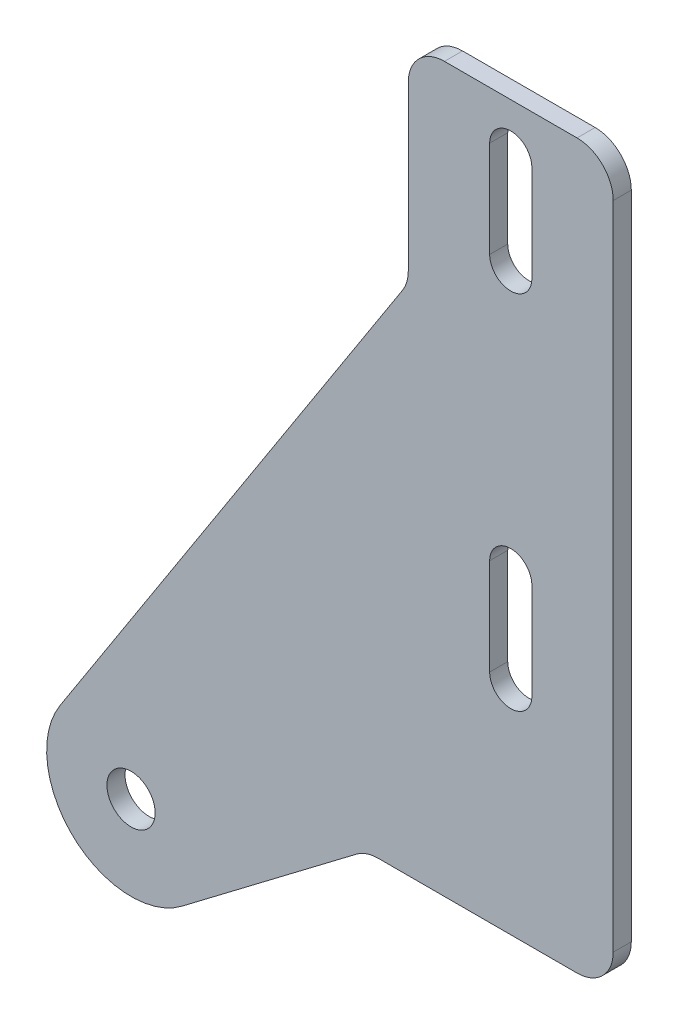
ISO-10303-21;
HEADER;
FILE_DESCRIPTION(('STEP AP214'),'2;1');
FILE_NAME('part.step','',(''),(''),'','','');
FILE_SCHEMA(('AUTOMOTIVE_DESIGN { 1 0 10303 214 1 1 1 1 }'));
ENDSEC;
DATA;
#1=APPLICATION_CONTEXT('core data for automotive mechanical design processes');
#2=APPLICATION_PROTOCOL_DEFINITION('international standard','automotive_design',2000,#1);
#3=PRODUCT_CONTEXT('',#1,'mechanical');
#4=PRODUCT('Part','Part','',(#3));
#5=PRODUCT_RELATED_PRODUCT_CATEGORY('part','',(#4));
#6=PRODUCT_DEFINITION_FORMATION('','',#4);
#7=PRODUCT_DEFINITION_CONTEXT('part definition',#1,'design');
#8=PRODUCT_DEFINITION('design','',#6,#7);
#9=PRODUCT_DEFINITION_SHAPE('','',#8);
#10=(LENGTH_UNIT() NAMED_UNIT(*) SI_UNIT(.MILLI.,.METRE.));
#11=(NAMED_UNIT(*) PLANE_ANGLE_UNIT() SI_UNIT($,.RADIAN.));
#12=(NAMED_UNIT(*) SI_UNIT($,.STERADIAN.) SOLID_ANGLE_UNIT());
#13=UNCERTAINTY_MEASURE_WITH_UNIT(LENGTH_MEASURE(1.E-05),#10,'distance_accuracy_value','');
#14=(GEOMETRIC_REPRESENTATION_CONTEXT(3) GLOBAL_UNCERTAINTY_ASSIGNED_CONTEXT((#13)) GLOBAL_UNIT_ASSIGNED_CONTEXT((#10,
#11,#12)) REPRESENTATION_CONTEXT('',''));
#15=CARTESIAN_POINT('',(0.,0.,0.));
#16=DIRECTION('',(0.,0.,1.));
#17=DIRECTION('',(1.,0.,0.));
#18=AXIS2_PLACEMENT_3D('',#15,#16,#17);
#19=CARTESIAN_POINT('',(-8.5,38.,-1.5));
#20=DIRECTION('',(-1.,0.,0.));
#21=DIRECTION('',(0.,-1.,0.));
#22=AXIS2_PLACEMENT_3D('',#19,#20,#21);
#23=PLANE('',#22);
#24=DIRECTION('',(0.,-1.,0.));
#25=VECTOR('',#24,1.);
#26=CARTESIAN_POINT('',(-8.5,38.,-1.5));
#27=LINE('',#26,#25);
#28=CARTESIAN_POINT('',(-8.5,35.,-1.5));
#29=VERTEX_POINT('',#28);
#30=CARTESIAN_POINT('',(-8.5,21.4410366100826,-1.5));
#31=VERTEX_POINT('',#30);
#32=EDGE_CURVE('E256',#29,#31,#27,.T.);
#33=ORIENTED_EDGE('',*,*,#32,.T.);
#34=DIRECTION('',(0.,0.,1.));
#35=VECTOR('',#34,1.);
#36=CARTESIAN_POINT('',(-8.5,21.4410366100826,0.));
#37=LINE('',#36,#35);
#38=CARTESIAN_POINT('',(-8.5,21.4410366100826,0.));
#39=VERTEX_POINT('',#38);
#40=EDGE_CURVE('E301',#31,#39,#37,.T.);
#41=ORIENTED_EDGE('',*,*,#40,.T.);
#42=DIRECTION('',(0.,-1.,0.));
#43=VECTOR('',#42,1.);
#44=CARTESIAN_POINT('',(-8.5,38.,0.));
#45=LINE('',#44,#43);
#46=CARTESIAN_POINT('',(-8.5,35.,0.));
#47=VERTEX_POINT('',#46);
#48=EDGE_CURVE('E249',#47,#39,#45,.T.);
#49=ORIENTED_EDGE('',*,*,#48,.F.);
#50=DIRECTION('',(0.,0.,1.));
#51=VECTOR('',#50,1.);
#52=CARTESIAN_POINT('',(-8.5,35.,-1.5));
#53=LINE('',#52,#51);
#54=EDGE_CURVE('E297',#47,#29,#53,.F.);
#55=ORIENTED_EDGE('',*,*,#54,.T.);
#56=EDGE_LOOP('',(#33,#41,#49,#55));
#57=FACE_BOUND('',#56,.T.);
#58=ADVANCED_FACE('F38',(#57),#23,.T.);
#59=CARTESIAN_POINT('',(-8.5,38.,-1.5));
#60=DIRECTION('',(0.,1.,0.));
#61=DIRECTION('',(0.,0.,1.));
#62=AXIS2_PLACEMENT_3D('',#59,#60,#61);
#63=PLANE('',#62);
#64=DIRECTION('',(-1.,0.,0.));
#65=VECTOR('',#64,1.);
#66=CARTESIAN_POINT('',(-8.5,38.,-1.5));
#67=LINE('',#66,#65);
#68=CARTESIAN_POINT('',(5.5,38.,-1.5));
#69=VERTEX_POINT('',#68);
#70=CARTESIAN_POINT('',(-5.5,38.,-1.5));
#71=VERTEX_POINT('',#70);
#72=EDGE_CURVE('E274',#69,#71,#67,.T.);
#73=ORIENTED_EDGE('',*,*,#72,.T.);
#74=DIRECTION('',(0.,0.,1.));
#75=VECTOR('',#74,1.);
#76=CARTESIAN_POINT('',(-5.5,38.,-1.5));
#77=LINE('',#76,#75);
#78=CARTESIAN_POINT('',(-5.5,38.,0.));
#79=VERTEX_POINT('',#78);
#80=EDGE_CURVE('E331',#71,#79,#77,.T.);
#81=ORIENTED_EDGE('',*,*,#80,.T.);
#82=DIRECTION('',(-1.,0.,0.));
#83=VECTOR('',#82,1.);
#84=CARTESIAN_POINT('',(-8.5,38.,0.));
#85=LINE('',#84,#83);
#86=CARTESIAN_POINT('',(5.5,38.,0.));
#87=VERTEX_POINT('',#86);
#88=EDGE_CURVE('E260',#87,#79,#85,.T.);
#89=ORIENTED_EDGE('',*,*,#88,.F.);
#90=DIRECTION('',(0.,0.,1.));
#91=VECTOR('',#90,1.);
#92=CARTESIAN_POINT('',(5.5,38.,-1.5));
#93=LINE('',#92,#91);
#94=EDGE_CURVE('E60',#87,#69,#93,.F.);
#95=ORIENTED_EDGE('',*,*,#94,.T.);
#96=EDGE_LOOP('',(#73,#81,#89,#95));
#97=FACE_BOUND('',#96,.T.);
#98=ADVANCED_FACE('F373',(#97),#63,.T.);
#99=CARTESIAN_POINT('',(8.5,38.,-1.5));
#100=DIRECTION('',(1.,0.,0.));
#101=DIRECTION('',(0.,1.,0.));
#102=AXIS2_PLACEMENT_3D('',#99,#100,#101);
#103=PLANE('',#102);
#104=DIRECTION('',(0.,1.,0.));
#105=VECTOR('',#104,1.);
#106=CARTESIAN_POINT('',(8.5,38.,0.));
#107=LINE('',#106,#105);
#108=CARTESIAN_POINT('',(8.50000000000001,-19.,0.));
#109=VERTEX_POINT('',#108);
#110=CARTESIAN_POINT('',(8.5,35.,0.));
#111=VERTEX_POINT('',#110);
#112=EDGE_CURVE('E290',#109,#111,#107,.T.);
#113=ORIENTED_EDGE('',*,*,#112,.F.);
#114=DIRECTION('',(0.,0.,1.));
#115=VECTOR('',#114,1.);
#116=CARTESIAN_POINT('',(8.50000000000001,-19.,-1.5));
#117=LINE('',#116,#115);
#118=CARTESIAN_POINT('',(8.50000000000001,-19.,-1.5));
#119=VERTEX_POINT('',#118);
#120=EDGE_CURVE('E323',#109,#119,#117,.F.);
#121=ORIENTED_EDGE('',*,*,#120,.T.);
#122=DIRECTION('',(0.,1.,0.));
#123=VECTOR('',#122,1.);
#124=CARTESIAN_POINT('',(8.5,38.,-1.5));
#125=LINE('',#124,#123);
#126=CARTESIAN_POINT('',(8.5,35.,-1.5));
#127=VERTEX_POINT('',#126);
#128=EDGE_CURVE('E271',#119,#127,#125,.T.);
#129=ORIENTED_EDGE('',*,*,#128,.T.);
#130=DIRECTION('',(0.,0.,1.));
#131=VECTOR('',#130,1.);
#132=CARTESIAN_POINT('',(8.5,35.,-1.5));
#133=LINE('',#132,#131);
#134=EDGE_CURVE('E320',#127,#111,#133,.T.);
#135=ORIENTED_EDGE('',*,*,#134,.T.);
#136=EDGE_LOOP('',(#113,#121,#129,#135));
#137=FACE_BOUND('',#136,.T.);
#138=ADVANCED_FACE('F379',(#137),#103,.T.);
#139=CARTESIAN_POINT('',(-12.,-22.,-1.5));
#140=DIRECTION('',(0.,-1.,0.));
#141=DIRECTION('',(0.,0.,-1.));
#142=AXIS2_PLACEMENT_3D('',#139,#140,#141);
#143=PLANE('',#142);
#144=DIRECTION('',(1.,0.,0.));
#145=VECTOR('',#144,1.);
#146=CARTESIAN_POINT('',(-12.,-22.,0.));
#147=LINE('',#146,#145);
#148=CARTESIAN_POINT('',(-10.9913036902104,-22.,0.));
#149=VERTEX_POINT('',#148);
#150=CARTESIAN_POINT('',(5.5,-22.,0.));
#151=VERTEX_POINT('',#150);
#152=EDGE_CURVE('E287',#149,#151,#147,.T.);
#153=ORIENTED_EDGE('',*,*,#152,.F.);
#154=DIRECTION('',(0.,0.,1.));
#155=VECTOR('',#154,1.);
#156=CARTESIAN_POINT('',(-10.9913036902104,-22.,-1.5));
#157=LINE('',#156,#155);
#158=CARTESIAN_POINT('',(-10.9913036902104,-22.,-1.5));
#159=VERTEX_POINT('',#158);
#160=EDGE_CURVE('E312',#149,#159,#157,.F.);
#161=ORIENTED_EDGE('',*,*,#160,.T.);
#162=DIRECTION('',(1.,0.,0.));
#163=VECTOR('',#162,1.);
#164=CARTESIAN_POINT('',(-12.,-22.,-1.5));
#165=LINE('',#164,#163);
#166=CARTESIAN_POINT('',(5.5,-22.,-1.5));
#167=VERTEX_POINT('',#166);
#168=EDGE_CURVE('E268',#159,#167,#165,.T.);
#169=ORIENTED_EDGE('',*,*,#168,.T.);
#170=DIRECTION('',(0.,0.,1.));
#171=VECTOR('',#170,1.);
#172=CARTESIAN_POINT('',(5.50000000000001,-22.,-1.5));
#173=LINE('',#172,#171);
#174=EDGE_CURVE('E309',#167,#151,#173,.T.);
#175=ORIENTED_EDGE('',*,*,#174,.T.);
#176=EDGE_LOOP('',(#153,#161,#169,#175));
#177=FACE_BOUND('',#176,.T.);
#178=ADVANCED_FACE('F345',(#177),#143,.T.);
#179=CARTESIAN_POINT('',(-27.270863059068,-33.5780283913623,-1.5));
#180=DIRECTION('',(0.604162420133143,-0.796861198766048,0.));
#181=DIRECTION('',(0.796861198766048,0.604162420133143,0.));
#182=AXIS2_PLACEMENT_3D('',#179,#180,#181);
#183=PLANE('',#182);
#184=DIRECTION('',(0.796861198766048,0.604162420133143,0.));
#185=VECTOR('',#184,1.);
#186=CARTESIAN_POINT('',(-27.270863059068,-33.5780283913623,-1.5));
#187=LINE('',#186,#185);
#188=CARTESIAN_POINT('',(-27.270863059068,-33.5780283913623,-1.5));
#189=VERTEX_POINT('',#188);
#190=CARTESIAN_POINT('',(-12.8037909506098,-22.6094164037019,-1.5));
#191=VERTEX_POINT('',#190);
#192=EDGE_CURVE('E265',#189,#191,#187,.T.);
#193=ORIENTED_EDGE('',*,*,#192,.T.);
#194=DIRECTION('',(0.,0.,1.));
#195=VECTOR('',#194,1.);
#196=CARTESIAN_POINT('',(-12.8037909506098,-22.6094164037019,0.));
#197=LINE('',#196,#195);
#198=CARTESIAN_POINT('',(-12.8037909506098,-22.6094164037019,0.));
#199=VERTEX_POINT('',#198);
#200=EDGE_CURVE('E306',#191,#199,#197,.T.);
#201=ORIENTED_EDGE('',*,*,#200,.T.);
#202=DIRECTION('',(0.796861198766048,0.604162420133143,0.));
#203=VECTOR('',#202,1.);
#204=CARTESIAN_POINT('',(-27.270863059068,-33.5780283913623,0.));
#205=LINE('',#204,#203);
#206=CARTESIAN_POINT('',(-27.270863059068,-33.5780283913623,0.));
#207=VERTEX_POINT('',#206);
#208=EDGE_CURVE('E284',#207,#199,#205,.T.);
#209=ORIENTED_EDGE('',*,*,#208,.F.);
#210=DIRECTION('',(0.,0.,1.));
#211=VECTOR('',#210,1.);
#212=CARTESIAN_POINT('',(-27.270863059068,-33.5780283913623,-1.5));
#213=LINE('',#212,#211);
#214=EDGE_CURVE('E295',#189,#207,#213,.T.);
#215=ORIENTED_EDGE('',*,*,#214,.F.);
#216=EDGE_LOOP('',(#193,#201,#209,#215));
#217=FACE_BOUND('',#216,.T.);
#218=ADVANCED_FACE('F354',(#217),#183,.T.);
#219=CARTESIAN_POINT('',(-31.5,-28.,-1.5));
#220=DIRECTION('',(0.,0.,1.));
#221=DIRECTION('',(1.,0.,0.));
#222=AXIS2_PLACEMENT_3D('',#219,#220,#221);
#223=CYLINDRICAL_SURFACE('',#222,7.);
#224=CARTESIAN_POINT('',(-31.5,-28.,0.));
#225=DIRECTION('',(0.,0.,1.));
#226=DIRECTION('',(1.,0.,0.));
#227=AXIS2_PLACEMENT_3D('',#224,#225,#226);
#228=CIRCLE('',#227,7.);
#229=CARTESIAN_POINT('',(-37.3818868455753,-24.204817904784,0.));
#230=VERTEX_POINT('',#229);
#231=EDGE_CURVE('E281',#230,#207,#228,.T.);
#232=ORIENTED_EDGE('',*,*,#231,.F.);
#233=DIRECTION('',(0.,0.,1.));
#234=VECTOR('',#233,1.);
#235=CARTESIAN_POINT('',(-37.3818868455753,-24.204817904784,-1.5));
#236=LINE('',#235,#234);
#237=CARTESIAN_POINT('',(-37.3818868455753,-24.204817904784,-1.5));
#238=VERTEX_POINT('',#237);
#239=EDGE_CURVE('E276',#238,#230,#236,.T.);
#240=ORIENTED_EDGE('',*,*,#239,.F.);
#241=CARTESIAN_POINT('',(-31.5,-28.,-1.5));
#242=DIRECTION('',(0.,0.,1.));
#243=DIRECTION('',(1.,0.,0.));
#244=AXIS2_PLACEMENT_3D('',#241,#242,#243);
#245=CIRCLE('',#244,7.);
#246=EDGE_CURVE('E262',#238,#189,#245,.T.);
#247=ORIENTED_EDGE('',*,*,#246,.T.);
#248=ORIENTED_EDGE('',*,*,#214,.T.);
#249=EDGE_LOOP('',(#232,#240,#247,#248));
#250=FACE_BOUND('',#249,.T.);
#251=ADVANCED_FACE('F357',(#250),#223,.T.);
#252=CARTESIAN_POINT('',(-37.3818868455753,-24.204817904784,-1.5));
#253=DIRECTION('',(-0.840269549367899,0.542168870745148,0.));
#254=DIRECTION('',(-0.542168870745148,-0.840269549367899,0.));
#255=AXIS2_PLACEMENT_3D('',#252,#253,#254);
#256=PLANE('',#255);
#257=DIRECTION('',(-0.542168870745148,-0.840269549367899,0.));
#258=VECTOR('',#257,1.);
#259=CARTESIAN_POINT('',(-37.3818868455753,-24.204817904784,0.));
#260=LINE('',#259,#258);
#261=CARTESIAN_POINT('',(-8.97919135189629,19.8145299978472,0.));
#262=VERTEX_POINT('',#261);
#263=EDGE_CURVE('E279',#262,#230,#260,.T.);
#264=ORIENTED_EDGE('',*,*,#263,.F.);
#265=DIRECTION('',(0.,0.,1.));
#266=VECTOR('',#265,1.);
#267=CARTESIAN_POINT('',(-8.9791913518963,19.8145299978472,-1.5));
#268=LINE('',#267,#266);
#269=CARTESIAN_POINT('',(-8.97919135189629,19.8145299978472,-1.5));
#270=VERTEX_POINT('',#269);
#271=EDGE_CURVE('E304',#262,#270,#268,.F.);
#272=ORIENTED_EDGE('',*,*,#271,.T.);
#273=DIRECTION('',(-0.542168870745148,-0.840269549367899,0.));
#274=VECTOR('',#273,1.);
#275=CARTESIAN_POINT('',(-37.3818868455753,-24.204817904784,-1.5));
#276=LINE('',#275,#274);
#277=EDGE_CURVE('E259',#270,#238,#276,.T.);
#278=ORIENTED_EDGE('',*,*,#277,.T.);
#279=ORIENTED_EDGE('',*,*,#239,.T.);
#280=EDGE_LOOP('',(#264,#272,#278,#279));
#281=FACE_BOUND('',#280,.T.);
#282=ADVANCED_FACE('F399',(#281),#256,.T.);
#283=CARTESIAN_POINT('',(-31.5,-28.,-1.5));
#284=DIRECTION('',(0.,0.,1.));
#285=DIRECTION('',(1.,0.,0.));
#286=AXIS2_PLACEMENT_3D('',#283,#284,#285);
#287=PLANE('',#286);
#288=CARTESIAN_POINT('',(-31.5,-28.,-1.5));
#289=DIRECTION('',(0.,0.,1.));
#290=DIRECTION('',(1.,0.,0.));
#291=AXIS2_PLACEMENT_3D('',#288,#289,#290);
#292=CIRCLE('',#291,2.00000000000001);
#293=CARTESIAN_POINT('',(-29.5,-28.,-1.5));
#294=VERTEX_POINT('',#293);
#295=EDGE_CURVE('E214',#294,#294,#292,.T.);
#296=ORIENTED_EDGE('',*,*,#295,.T.);
#297=EDGE_LOOP('',(#296));
#298=FACE_BOUND('',#297,.T.);
#299=DIRECTION('',(0.,1.,0.));
#300=VECTOR('',#299,1.);
#301=CARTESIAN_POINT('',(1.74999999999999,34.,-1.5));
#302=LINE('',#301,#300);
#303=CARTESIAN_POINT('',(1.74999999999999,26.,-1.5));
#304=VERTEX_POINT('',#303);
#305=CARTESIAN_POINT('',(1.74999999999999,34.,-1.5));
#306=VERTEX_POINT('',#305);
#307=EDGE_CURVE('E188',#304,#306,#302,.T.);
#308=ORIENTED_EDGE('',*,*,#307,.T.);
#309=CARTESIAN_POINT('',(0.,34.,-1.5));
#310=DIRECTION('',(0.,0.,1.));
#311=DIRECTION('',(1.,0.,0.));
#312=AXIS2_PLACEMENT_3D('',#309,#310,#311);
#313=CIRCLE('',#312,1.75);
#314=CARTESIAN_POINT('',(-1.75,34.,-1.5));
#315=VERTEX_POINT('',#314);
#316=EDGE_CURVE('E180',#306,#315,#313,.T.);
#317=ORIENTED_EDGE('',*,*,#316,.T.);
#318=DIRECTION('',(0.,-1.,0.));
#319=VECTOR('',#318,1.);
#320=CARTESIAN_POINT('',(-1.75,34.,-1.5));
#321=LINE('',#320,#319);
#322=CARTESIAN_POINT('',(-1.75,26.,-1.5));
#323=VERTEX_POINT('',#322);
#324=EDGE_CURVE('E192',#315,#323,#321,.T.);
#325=ORIENTED_EDGE('',*,*,#324,.T.);
#326=CARTESIAN_POINT('',(0.,26.,-1.5));
#327=DIRECTION('',(0.,0.,1.));
#328=DIRECTION('',(1.,0.,0.));
#329=AXIS2_PLACEMENT_3D('',#326,#327,#328);
#330=CIRCLE('',#329,1.75);
#331=EDGE_CURVE('E196',#323,#304,#330,.T.);
#332=ORIENTED_EDGE('',*,*,#331,.T.);
#333=EDGE_LOOP('',(#308,#317,#325,#332));
#334=FACE_BOUND('',#333,.T.);
#335=DIRECTION('',(0.,1.,0.));
#336=VECTOR('',#335,1.);
#337=CARTESIAN_POINT('',(1.75,4.,-1.5));
#338=LINE('',#337,#336);
#339=CARTESIAN_POINT('',(1.75,-4.,-1.5));
#340=VERTEX_POINT('',#339);
#341=CARTESIAN_POINT('',(1.75,4.,-1.5));
#342=VERTEX_POINT('',#341);
#343=EDGE_CURVE('E234',#340,#342,#338,.T.);
#344=ORIENTED_EDGE('',*,*,#343,.T.);
#345=CARTESIAN_POINT('',(0.,4.,-1.5));
#346=DIRECTION('',(0.,0.,1.));
#347=DIRECTION('',(1.,0.,0.));
#348=AXIS2_PLACEMENT_3D('',#345,#346,#347);
#349=CIRCLE('',#348,1.75);
#350=CARTESIAN_POINT('',(-1.75,4.,-1.5));
#351=VERTEX_POINT('',#350);
#352=EDGE_CURVE('E224',#342,#351,#349,.T.);
#353=ORIENTED_EDGE('',*,*,#352,.T.);
#354=DIRECTION('',(0.,-1.,0.));
#355=VECTOR('',#354,1.);
#356=CARTESIAN_POINT('',(-1.75,4.,-1.5));
#357=LINE('',#356,#355);
#358=CARTESIAN_POINT('',(-1.75,-4.,-1.5));
#359=VERTEX_POINT('',#358);
#360=EDGE_CURVE('E227',#351,#359,#357,.T.);
#361=ORIENTED_EDGE('',*,*,#360,.T.);
#362=CARTESIAN_POINT('',(0.,-4.,-1.5));
#363=DIRECTION('',(0.,0.,1.));
#364=DIRECTION('',(1.,0.,0.));
#365=AXIS2_PLACEMENT_3D('',#362,#363,#364);
#366=CIRCLE('',#365,1.75);
#367=EDGE_CURVE('E231',#359,#340,#366,.T.);
#368=ORIENTED_EDGE('',*,*,#367,.T.);
#369=EDGE_LOOP('',(#344,#353,#361,#368));
#370=FACE_BOUND('',#369,.T.);
#371=ORIENTED_EDGE('',*,*,#128,.F.);
#372=CARTESIAN_POINT('',(5.50000000000001,-19.,-1.5));
#373=DIRECTION('',(0.,0.,1.));
#374=DIRECTION('',(1.,0.,0.));
#375=AXIS2_PLACEMENT_3D('',#372,#373,#374);
#376=CIRCLE('',#375,3.);
#377=EDGE_CURVE('E328',#119,#167,#376,.F.);
#378=ORIENTED_EDGE('',*,*,#377,.T.);
#379=ORIENTED_EDGE('',*,*,#168,.F.);
#380=CARTESIAN_POINT('',(-10.9913036902104,-25.,-1.5));
#381=DIRECTION('',(0.,0.,1.));
#382=DIRECTION('',(1.,0.,0.));
#383=AXIS2_PLACEMENT_3D('',#380,#381,#382);
#384=CIRCLE('',#383,3.);
#385=EDGE_CURVE('E11',#159,#191,#384,.T.);
#386=ORIENTED_EDGE('',*,*,#385,.T.);
#387=ORIENTED_EDGE('',*,*,#192,.F.);
#388=ORIENTED_EDGE('',*,*,#246,.F.);
#389=ORIENTED_EDGE('',*,*,#277,.F.);
#390=CARTESIAN_POINT('',(-11.5,21.4410366100826,-1.5));
#391=DIRECTION('',(0.,0.,1.));
#392=DIRECTION('',(1.,0.,0.));
#393=AXIS2_PLACEMENT_3D('',#390,#391,#392);
#394=CIRCLE('',#393,3.);
#395=EDGE_CURVE('E336',#270,#31,#394,.T.);
#396=ORIENTED_EDGE('',*,*,#395,.T.);
#397=ORIENTED_EDGE('',*,*,#32,.F.);
#398=CARTESIAN_POINT('',(-5.5,35.,-1.5));
#399=DIRECTION('',(0.,0.,1.));
#400=DIRECTION('',(1.,0.,0.));
#401=AXIS2_PLACEMENT_3D('',#398,#399,#400);
#402=CIRCLE('',#401,3.);
#403=EDGE_CURVE('E53',#29,#71,#402,.F.);
#404=ORIENTED_EDGE('',*,*,#403,.T.);
#405=ORIENTED_EDGE('',*,*,#72,.F.);
#406=CARTESIAN_POINT('',(5.5,35.,-1.5));
#407=DIRECTION('',(0.,0.,1.));
#408=DIRECTION('',(1.,0.,0.));
#409=AXIS2_PLACEMENT_3D('',#406,#407,#408);
#410=CIRCLE('',#409,3.);
#411=EDGE_CURVE('E325',#69,#127,#410,.F.);
#412=ORIENTED_EDGE('',*,*,#411,.T.);
#413=EDGE_LOOP('',(#371,#378,#379,#386,#387,#388,#389,#396,#397,#404,#405,#412));
#414=FACE_BOUND('',#413,.T.);
#415=ADVANCED_FACE('F198',(#298,#334,#370,#414),#287,.F.);
#416=CARTESIAN_POINT('',(-31.5,-28.,0.));
#417=DIRECTION('',(0.,0.,1.));
#418=DIRECTION('',(1.,0.,0.));
#419=AXIS2_PLACEMENT_3D('',#416,#417,#418);
#420=PLANE('',#419);
#421=CARTESIAN_POINT('',(-31.5,-28.,0.));
#422=DIRECTION('',(0.,0.,1.));
#423=DIRECTION('',(1.,0.,0.));
#424=AXIS2_PLACEMENT_3D('',#421,#422,#423);
#425=CIRCLE('',#424,2.00000000000001);
#426=CARTESIAN_POINT('',(-29.5,-28.,0.));
#427=VERTEX_POINT('',#426);
#428=EDGE_CURVE('E207',#427,#427,#425,.T.);
#429=ORIENTED_EDGE('',*,*,#428,.F.);
#430=EDGE_LOOP('',(#429));
#431=FACE_BOUND('',#430,.T.);
#432=CARTESIAN_POINT('',(0.,34.,0.));
#433=DIRECTION('',(0.,0.,1.));
#434=DIRECTION('',(1.,0.,0.));
#435=AXIS2_PLACEMENT_3D('',#432,#433,#434);
#436=CIRCLE('',#435,1.75);
#437=CARTESIAN_POINT('',(1.74999999999999,34.,0.));
#438=VERTEX_POINT('',#437);
#439=CARTESIAN_POINT('',(-1.75,34.,0.));
#440=VERTEX_POINT('',#439);
#441=EDGE_CURVE('E183',#438,#440,#436,.T.);
#442=ORIENTED_EDGE('',*,*,#441,.F.);
#443=DIRECTION('',(0.,1.,0.));
#444=VECTOR('',#443,1.);
#445=CARTESIAN_POINT('',(1.74999999999999,34.,0.));
#446=LINE('',#445,#444);
#447=CARTESIAN_POINT('',(1.74999999999999,26.,0.));
#448=VERTEX_POINT('',#447);
#449=EDGE_CURVE('E201',#448,#438,#446,.T.);
#450=ORIENTED_EDGE('',*,*,#449,.F.);
#451=CARTESIAN_POINT('',(0.,26.,0.));
#452=DIRECTION('',(0.,0.,1.));
#453=DIRECTION('',(1.,0.,0.));
#454=AXIS2_PLACEMENT_3D('',#451,#452,#453);
#455=CIRCLE('',#454,1.75);
#456=CARTESIAN_POINT('',(-1.75,26.,0.));
#457=VERTEX_POINT('',#456);
#458=EDGE_CURVE('E204',#457,#448,#455,.T.);
#459=ORIENTED_EDGE('',*,*,#458,.F.);
#460=DIRECTION('',(0.,-1.,0.));
#461=VECTOR('',#460,1.);
#462=CARTESIAN_POINT('',(-1.75,34.,0.));
#463=LINE('',#462,#461);
#464=EDGE_CURVE('E213',#440,#457,#463,.T.);
#465=ORIENTED_EDGE('',*,*,#464,.F.);
#466=EDGE_LOOP('',(#442,#450,#459,#465));
#467=FACE_BOUND('',#466,.T.);
#468=CARTESIAN_POINT('',(0.,4.,0.));
#469=DIRECTION('',(0.,0.,1.));
#470=DIRECTION('',(1.,0.,0.));
#471=AXIS2_PLACEMENT_3D('',#468,#469,#470);
#472=CIRCLE('',#471,1.75);
#473=CARTESIAN_POINT('',(1.75,4.,0.));
#474=VERTEX_POINT('',#473);
#475=CARTESIAN_POINT('',(-1.75,4.,0.));
#476=VERTEX_POINT('',#475);
#477=EDGE_CURVE('E220',#474,#476,#472,.T.);
#478=ORIENTED_EDGE('',*,*,#477,.F.);
#479=DIRECTION('',(0.,1.,0.));
#480=VECTOR('',#479,1.);
#481=CARTESIAN_POINT('',(1.75,4.,0.));
#482=LINE('',#481,#480);
#483=CARTESIAN_POINT('',(1.75,-4.,0.));
#484=VERTEX_POINT('',#483);
#485=EDGE_CURVE('E228',#484,#474,#482,.T.);
#486=ORIENTED_EDGE('',*,*,#485,.F.);
#487=CARTESIAN_POINT('',(0.,-4.,0.));
#488=DIRECTION('',(0.,0.,1.));
#489=DIRECTION('',(1.,0.,0.));
#490=AXIS2_PLACEMENT_3D('',#487,#488,#489);
#491=CIRCLE('',#490,1.75);
#492=CARTESIAN_POINT('',(-1.75,-4.,0.));
#493=VERTEX_POINT('',#492);
#494=EDGE_CURVE('E242',#493,#484,#491,.T.);
#495=ORIENTED_EDGE('',*,*,#494,.F.);
#496=DIRECTION('',(0.,-1.,0.));
#497=VECTOR('',#496,1.);
#498=CARTESIAN_POINT('',(-1.75,4.,0.));
#499=LINE('',#498,#497);
#500=EDGE_CURVE('E239',#476,#493,#499,.T.);
#501=ORIENTED_EDGE('',*,*,#500,.F.);
#502=EDGE_LOOP('',(#478,#486,#495,#501));
#503=FACE_BOUND('',#502,.T.);
#504=ORIENTED_EDGE('',*,*,#152,.T.);
#505=CARTESIAN_POINT('',(5.50000000000001,-19.,0.));
#506=DIRECTION('',(0.,0.,1.));
#507=DIRECTION('',(1.,0.,0.));
#508=AXIS2_PLACEMENT_3D('',#505,#506,#507);
#509=CIRCLE('',#508,3.);
#510=EDGE_CURVE('E318',#151,#109,#509,.T.);
#511=ORIENTED_EDGE('',*,*,#510,.T.);
#512=ORIENTED_EDGE('',*,*,#112,.T.);
#513=CARTESIAN_POINT('',(5.5,35.,0.));
#514=DIRECTION('',(0.,0.,1.));
#515=DIRECTION('',(1.,0.,0.));
#516=AXIS2_PLACEMENT_3D('',#513,#514,#515);
#517=CIRCLE('',#516,3.);
#518=EDGE_CURVE('E314',#111,#87,#517,.T.);
#519=ORIENTED_EDGE('',*,*,#518,.T.);
#520=ORIENTED_EDGE('',*,*,#88,.T.);
#521=CARTESIAN_POINT('',(-5.5,35.,0.));
#522=DIRECTION('',(0.,0.,1.));
#523=DIRECTION('',(1.,0.,0.));
#524=AXIS2_PLACEMENT_3D('',#521,#522,#523);
#525=CIRCLE('',#524,3.);
#526=EDGE_CURVE('E316',#79,#47,#525,.T.);
#527=ORIENTED_EDGE('',*,*,#526,.T.);
#528=ORIENTED_EDGE('',*,*,#48,.T.);
#529=CARTESIAN_POINT('',(-11.5,21.4410366100826,0.));
#530=DIRECTION('',(0.,0.,1.));
#531=DIRECTION('',(1.,0.,0.));
#532=AXIS2_PLACEMENT_3D('',#529,#530,#531);
#533=CIRCLE('',#532,3.);
#534=EDGE_CURVE('E334',#39,#262,#533,.F.);
#535=ORIENTED_EDGE('',*,*,#534,.T.);
#536=ORIENTED_EDGE('',*,*,#263,.T.);
#537=ORIENTED_EDGE('',*,*,#231,.T.);
#538=ORIENTED_EDGE('',*,*,#208,.T.);
#539=CARTESIAN_POINT('',(-10.9913036902104,-25.,0.));
#540=DIRECTION('',(0.,0.,1.));
#541=DIRECTION('',(1.,0.,0.));
#542=AXIS2_PLACEMENT_3D('',#539,#540,#541);
#543=CIRCLE('',#542,3.);
#544=EDGE_CURVE('E46',#199,#149,#543,.F.);
#545=ORIENTED_EDGE('',*,*,#544,.T.);
#546=EDGE_LOOP('',(#504,#511,#512,#519,#520,#527,#528,#535,#536,#537,#538,#545));
#547=FACE_BOUND('',#546,.T.);
#548=ADVANCED_FACE('F339',(#431,#467,#503,#547),#420,.T.);
#549=CARTESIAN_POINT('',(0.,4.,-1.5));
#550=DIRECTION('',(0.,0.,1.));
#551=DIRECTION('',(1.,0.,0.));
#552=AXIS2_PLACEMENT_3D('',#549,#550,#551);
#553=CYLINDRICAL_SURFACE('',#552,1.75);
#554=ORIENTED_EDGE('',*,*,#477,.T.);
#555=DIRECTION('',(0.,0.,1.));
#556=VECTOR('',#555,1.);
#557=CARTESIAN_POINT('',(-1.75,4.,-1.5));
#558=LINE('',#557,#556);
#559=EDGE_CURVE('E237',#351,#476,#558,.T.);
#560=ORIENTED_EDGE('',*,*,#559,.F.);
#561=ORIENTED_EDGE('',*,*,#352,.F.);
#562=DIRECTION('',(0.,0.,1.));
#563=VECTOR('',#562,1.);
#564=CARTESIAN_POINT('',(1.75,4.,-1.5));
#565=LINE('',#564,#563);
#566=EDGE_CURVE('E247',#342,#474,#565,.T.);
#567=ORIENTED_EDGE('',*,*,#566,.T.);
#568=EDGE_LOOP('',(#554,#560,#561,#567));
#569=FACE_BOUND('',#568,.T.);
#570=ADVANCED_FACE('F430',(#569),#553,.F.);
#571=CARTESIAN_POINT('',(1.75,4.,-1.5));
#572=DIRECTION('',(1.,0.,0.));
#573=DIRECTION('',(0.,0.,-1.));
#574=AXIS2_PLACEMENT_3D('',#571,#572,#573);
#575=PLANE('',#574);
#576=ORIENTED_EDGE('',*,*,#485,.T.);
#577=ORIENTED_EDGE('',*,*,#566,.F.);
#578=ORIENTED_EDGE('',*,*,#343,.F.);
#579=DIRECTION('',(0.,0.,1.));
#580=VECTOR('',#579,1.);
#581=CARTESIAN_POINT('',(1.75,-4.,-1.5));
#582=LINE('',#581,#580);
#583=EDGE_CURVE('E250',#340,#484,#582,.T.);
#584=ORIENTED_EDGE('',*,*,#583,.T.);
#585=EDGE_LOOP('',(#576,#577,#578,#584));
#586=FACE_BOUND('',#585,.T.);
#587=ADVANCED_FACE('F426',(#586),#575,.F.);
#588=CARTESIAN_POINT('',(0.,-4.,-1.5));
#589=DIRECTION('',(0.,0.,1.));
#590=DIRECTION('',(1.,0.,0.));
#591=AXIS2_PLACEMENT_3D('',#588,#589,#590);
#592=CYLINDRICAL_SURFACE('',#591,1.75);
#593=ORIENTED_EDGE('',*,*,#494,.T.);
#594=ORIENTED_EDGE('',*,*,#583,.F.);
#595=ORIENTED_EDGE('',*,*,#367,.F.);
#596=DIRECTION('',(0.,0.,1.));
#597=VECTOR('',#596,1.);
#598=CARTESIAN_POINT('',(-1.75,-4.,-1.5));
#599=LINE('',#598,#597);
#600=EDGE_CURVE('E252',#359,#493,#599,.T.);
#601=ORIENTED_EDGE('',*,*,#600,.T.);
#602=EDGE_LOOP('',(#593,#594,#595,#601));
#603=FACE_BOUND('',#602,.T.);
#604=ADVANCED_FACE('F429',(#603),#592,.F.);
#605=CARTESIAN_POINT('',(-1.75,4.,-1.5));
#606=DIRECTION('',(-1.,0.,0.));
#607=DIRECTION('',(0.,0.,1.));
#608=AXIS2_PLACEMENT_3D('',#605,#606,#607);
#609=PLANE('',#608);
#610=ORIENTED_EDGE('',*,*,#500,.T.);
#611=ORIENTED_EDGE('',*,*,#600,.F.);
#612=ORIENTED_EDGE('',*,*,#360,.F.);
#613=ORIENTED_EDGE('',*,*,#559,.T.);
#614=EDGE_LOOP('',(#610,#611,#612,#613));
#615=FACE_BOUND('',#614,.T.);
#616=ADVANCED_FACE('F425',(#615),#609,.F.);
#617=CARTESIAN_POINT('',(0.,34.,-1.5));
#618=DIRECTION('',(0.,0.,1.));
#619=DIRECTION('',(1.,0.,0.));
#620=AXIS2_PLACEMENT_3D('',#617,#618,#619);
#621=CYLINDRICAL_SURFACE('',#620,1.75);
#622=ORIENTED_EDGE('',*,*,#441,.T.);
#623=DIRECTION('',(0.,0.,1.));
#624=VECTOR('',#623,1.);
#625=CARTESIAN_POINT('',(-1.75,34.,-1.5));
#626=LINE('',#625,#624);
#627=EDGE_CURVE('E176',#315,#440,#626,.T.);
#628=ORIENTED_EDGE('',*,*,#627,.F.);
#629=ORIENTED_EDGE('',*,*,#316,.F.);
#630=DIRECTION('',(0.,0.,1.));
#631=VECTOR('',#630,1.);
#632=CARTESIAN_POINT('',(1.74999999999999,34.,-1.5));
#633=LINE('',#632,#631);
#634=EDGE_CURVE('E218',#306,#438,#633,.T.);
#635=ORIENTED_EDGE('',*,*,#634,.T.);
#636=EDGE_LOOP('',(#622,#628,#629,#635));
#637=FACE_BOUND('',#636,.T.);
#638=ADVANCED_FACE('F178',(#637),#621,.F.);
#639=CARTESIAN_POINT('',(1.74999999999999,34.,-1.5));
#640=DIRECTION('',(1.,0.,0.));
#641=DIRECTION('',(0.,1.,0.));
#642=AXIS2_PLACEMENT_3D('',#639,#640,#641);
#643=PLANE('',#642);
#644=ORIENTED_EDGE('',*,*,#449,.T.);
#645=ORIENTED_EDGE('',*,*,#634,.F.);
#646=ORIENTED_EDGE('',*,*,#307,.F.);
#647=DIRECTION('',(0.,0.,1.));
#648=VECTOR('',#647,1.);
#649=CARTESIAN_POINT('',(1.74999999999999,26.,-1.5));
#650=LINE('',#649,#648);
#651=EDGE_CURVE('E221',#304,#448,#650,.T.);
#652=ORIENTED_EDGE('',*,*,#651,.T.);
#653=EDGE_LOOP('',(#644,#645,#646,#652));
#654=FACE_BOUND('',#653,.T.);
#655=ADVANCED_FACE('F416',(#654),#643,.F.);
#656=CARTESIAN_POINT('',(0.,26.,-1.5));
#657=DIRECTION('',(0.,0.,1.));
#658=DIRECTION('',(1.,0.,0.));
#659=AXIS2_PLACEMENT_3D('',#656,#657,#658);
#660=CYLINDRICAL_SURFACE('',#659,1.75);
#661=ORIENTED_EDGE('',*,*,#458,.T.);
#662=ORIENTED_EDGE('',*,*,#651,.F.);
#663=ORIENTED_EDGE('',*,*,#331,.F.);
#664=DIRECTION('',(0.,0.,1.));
#665=VECTOR('',#664,1.);
#666=CARTESIAN_POINT('',(-1.75,26.,-1.5));
#667=LINE('',#666,#665);
#668=EDGE_CURVE('E187',#323,#457,#667,.T.);
#669=ORIENTED_EDGE('',*,*,#668,.T.);
#670=EDGE_LOOP('',(#661,#662,#663,#669));
#671=FACE_BOUND('',#670,.T.);
#672=ADVANCED_FACE('F411',(#671),#660,.F.);
#673=CARTESIAN_POINT('',(-1.75,34.,-1.5));
#674=DIRECTION('',(-1.,0.,0.));
#675=DIRECTION('',(0.,-1.,0.));
#676=AXIS2_PLACEMENT_3D('',#673,#674,#675);
#677=PLANE('',#676);
#678=ORIENTED_EDGE('',*,*,#464,.T.);
#679=ORIENTED_EDGE('',*,*,#668,.F.);
#680=ORIENTED_EDGE('',*,*,#324,.F.);
#681=ORIENTED_EDGE('',*,*,#627,.T.);
#682=EDGE_LOOP('',(#678,#679,#680,#681));
#683=FACE_BOUND('',#682,.T.);
#684=ADVANCED_FACE('F193',(#683),#677,.F.);
#685=CARTESIAN_POINT('',(-31.5,-28.,-1.5));
#686=DIRECTION('',(0.,0.,1.));
#687=DIRECTION('',(1.,0.,0.));
#688=AXIS2_PLACEMENT_3D('',#685,#686,#687);
#689=CYLINDRICAL_SURFACE('',#688,2.00000000000001);
#690=ORIENTED_EDGE('',*,*,#295,.F.);
#691=EDGE_LOOP('',(#690));
#692=FACE_BOUND('',#691,.T.);
#693=ORIENTED_EDGE('',*,*,#428,.T.);
#694=EDGE_LOOP('',(#693));
#695=FACE_BOUND('',#694,.T.);
#696=ADVANCED_FACE('F402',(#692,#695),#689,.F.);
#697=CARTESIAN_POINT('',(-11.5,21.4410366100826,-1.5));
#698=DIRECTION('',(0.,0.,-1.));
#699=DIRECTION('',(-1.,0.,0.));
#700=AXIS2_PLACEMENT_3D('',#697,#698,#699);
#701=CYLINDRICAL_SURFACE('',#700,3.);
#702=ORIENTED_EDGE('',*,*,#395,.F.);
#703=ORIENTED_EDGE('',*,*,#271,.F.);
#704=ORIENTED_EDGE('',*,*,#534,.F.);
#705=ORIENTED_EDGE('',*,*,#40,.F.);
#706=EDGE_LOOP('',(#702,#703,#704,#705));
#707=FACE_BOUND('',#706,.T.);
#708=ADVANCED_FACE('F365',(#707),#701,.F.);
#709=CARTESIAN_POINT('',(-10.9913036902104,-25.,-1.5));
#710=DIRECTION('',(0.,0.,-1.));
#711=DIRECTION('',(-1.,0.,0.));
#712=AXIS2_PLACEMENT_3D('',#709,#710,#711);
#713=CYLINDRICAL_SURFACE('',#712,3.);
#714=ORIENTED_EDGE('',*,*,#385,.F.);
#715=ORIENTED_EDGE('',*,*,#160,.F.);
#716=ORIENTED_EDGE('',*,*,#544,.F.);
#717=ORIENTED_EDGE('',*,*,#200,.F.);
#718=EDGE_LOOP('',(#714,#715,#716,#717));
#719=FACE_BOUND('',#718,.T.);
#720=ADVANCED_FACE('F349',(#719),#713,.F.);
#721=CARTESIAN_POINT('',(5.50000000000001,-19.,-1.5));
#722=DIRECTION('',(0.,0.,1.));
#723=DIRECTION('',(1.,0.,0.));
#724=AXIS2_PLACEMENT_3D('',#721,#722,#723);
#725=CYLINDRICAL_SURFACE('',#724,3.);
#726=ORIENTED_EDGE('',*,*,#377,.F.);
#727=ORIENTED_EDGE('',*,*,#120,.F.);
#728=ORIENTED_EDGE('',*,*,#510,.F.);
#729=ORIENTED_EDGE('',*,*,#174,.F.);
#730=EDGE_LOOP('',(#726,#727,#728,#729));
#731=FACE_BOUND('',#730,.T.);
#732=ADVANCED_FACE('F383',(#731),#725,.T.);
#733=CARTESIAN_POINT('',(-5.5,35.,-1.5));
#734=DIRECTION('',(0.,0.,1.));
#735=DIRECTION('',(1.,0.,0.));
#736=AXIS2_PLACEMENT_3D('',#733,#734,#735);
#737=CYLINDRICAL_SURFACE('',#736,3.);
#738=ORIENTED_EDGE('',*,*,#403,.F.);
#739=ORIENTED_EDGE('',*,*,#54,.F.);
#740=ORIENTED_EDGE('',*,*,#526,.F.);
#741=ORIENTED_EDGE('',*,*,#80,.F.);
#742=EDGE_LOOP('',(#738,#739,#740,#741));
#743=FACE_BOUND('',#742,.T.);
#744=ADVANCED_FACE('F372',(#743),#737,.T.);
#745=CARTESIAN_POINT('',(5.5,35.,-1.5));
#746=DIRECTION('',(0.,0.,1.));
#747=DIRECTION('',(1.,0.,0.));
#748=AXIS2_PLACEMENT_3D('',#745,#746,#747);
#749=CYLINDRICAL_SURFACE('',#748,3.);
#750=ORIENTED_EDGE('',*,*,#411,.F.);
#751=ORIENTED_EDGE('',*,*,#94,.F.);
#752=ORIENTED_EDGE('',*,*,#518,.F.);
#753=ORIENTED_EDGE('',*,*,#134,.F.);
#754=EDGE_LOOP('',(#750,#751,#752,#753));
#755=FACE_BOUND('',#754,.T.);
#756=ADVANCED_FACE('F40',(#755),#749,.T.);
#757=CLOSED_SHELL('',(#58,#98,#138,#178,#218,#251,#282,#415,#548,#570,#587,#604,#616,#638,#655,
#672,#684,#696,#708,#720,#732,#744,#756));
#758=MANIFOLD_SOLID_BREP('B2',#757);
#759=ADVANCED_BREP_SHAPE_REPRESENTATION('',(#18,#758),#14);
#760=SHAPE_DEFINITION_REPRESENTATION(#9,#759);
ENDSEC;
END-ISO-10303-21;
